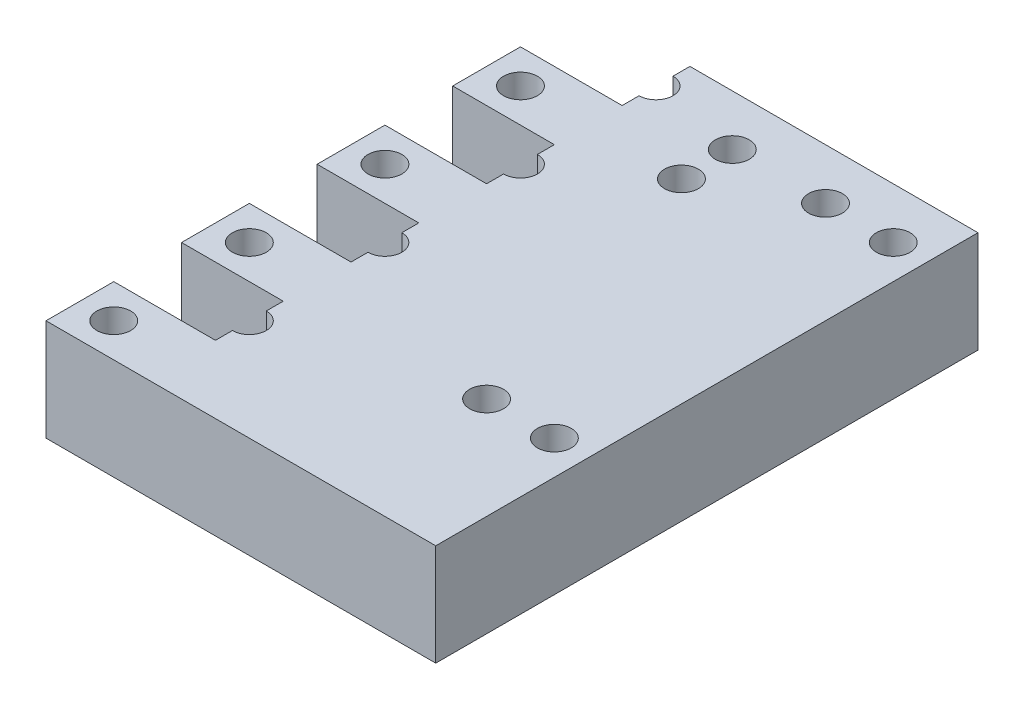
ISO-10303-21;
HEADER;
FILE_DESCRIPTION(('STEP AP214'),'2;1');
FILE_NAME('part.step','',(''),(''),'','','');
FILE_SCHEMA(('AUTOMOTIVE_DESIGN { 1 0 10303 214 1 1 1 1 }'));
ENDSEC;
DATA;
#1=APPLICATION_CONTEXT('core data for automotive mechanical design processes');
#2=APPLICATION_PROTOCOL_DEFINITION('international standard','automotive_design',2000,#1);
#3=PRODUCT_CONTEXT('',#1,'mechanical');
#4=PRODUCT('Part','Part','',(#3));
#5=PRODUCT_RELATED_PRODUCT_CATEGORY('part','',(#4));
#6=PRODUCT_DEFINITION_FORMATION('','',#4);
#7=PRODUCT_DEFINITION_CONTEXT('part definition',#1,'design');
#8=PRODUCT_DEFINITION('design','',#6,#7);
#9=PRODUCT_DEFINITION_SHAPE('','',#8);
#10=(LENGTH_UNIT() NAMED_UNIT(*) SI_UNIT(.MILLI.,.METRE.));
#11=(NAMED_UNIT(*) PLANE_ANGLE_UNIT() SI_UNIT($,.RADIAN.));
#12=(NAMED_UNIT(*) SI_UNIT($,.STERADIAN.) SOLID_ANGLE_UNIT());
#13=UNCERTAINTY_MEASURE_WITH_UNIT(LENGTH_MEASURE(1.E-05),#10,'distance_accuracy_value','');
#14=(GEOMETRIC_REPRESENTATION_CONTEXT(3) GLOBAL_UNCERTAINTY_ASSIGNED_CONTEXT((#13)) GLOBAL_UNIT_ASSIGNED_CONTEXT((#10,
#11,#12)) REPRESENTATION_CONTEXT('',''));
#15=CARTESIAN_POINT('',(0.,0.,0.));
#16=DIRECTION('',(0.,0.,1.));
#17=DIRECTION('',(1.,0.,0.));
#18=AXIS2_PLACEMENT_3D('',#15,#16,#17);
#19=CARTESIAN_POINT('',(6.,6.,-4.));
#20=DIRECTION('',(1.,0.,0.));
#21=DIRECTION('',(0.,0.,-1.));
#22=AXIS2_PLACEMENT_3D('',#19,#20,#21);
#23=PLANE('',#22);
#24=DIRECTION('',(0.,0.,1.));
#25=VECTOR('',#24,1.);
#26=CARTESIAN_POINT('',(6.,0.,-4.));
#27=LINE('',#26,#25);
#28=CARTESIAN_POINT('',(6.,0.,-8.));
#29=VERTEX_POINT('',#28);
#30=CARTESIAN_POINT('',(6.,0.,-7.));
#31=VERTEX_POINT('',#30);
#32=EDGE_CURVE('E228',#29,#31,#27,.T.);
#33=ORIENTED_EDGE('',*,*,#32,.T.);
#34=DIRECTION('',(0.,1.,0.));
#35=VECTOR('',#34,1.);
#36=CARTESIAN_POINT('',(6.,0.,-7.));
#37=LINE('',#36,#35);
#38=CARTESIAN_POINT('',(6.,6.,-7.));
#39=VERTEX_POINT('',#38);
#40=EDGE_CURVE('E49',#31,#39,#37,.T.);
#41=ORIENTED_EDGE('',*,*,#40,.T.);
#42=DIRECTION('',(0.,0.,1.));
#43=VECTOR('',#42,1.);
#44=CARTESIAN_POINT('',(6.,6.,-4.));
#45=LINE('',#44,#43);
#46=CARTESIAN_POINT('',(6.,6.,-8.));
#47=VERTEX_POINT('',#46);
#48=EDGE_CURVE('E346',#47,#39,#45,.T.);
#49=ORIENTED_EDGE('',*,*,#48,.F.);
#50=DIRECTION('',(0.,-1.,0.));
#51=VECTOR('',#50,1.);
#52=CARTESIAN_POINT('',(6.,6.,-8.));
#53=LINE('',#52,#51);
#54=EDGE_CURVE('E248',#47,#29,#53,.T.);
#55=ORIENTED_EDGE('',*,*,#54,.T.);
#56=EDGE_LOOP('',(#33,#41,#49,#55));
#57=FACE_BOUND('',#56,.T.);
#58=ADVANCED_FACE('F34',(#57),#23,.F.);
#59=CARTESIAN_POINT('',(6.,6.,-12.));
#60=DIRECTION('',(1.,0.,0.));
#61=DIRECTION('',(0.,0.,-1.));
#62=AXIS2_PLACEMENT_3D('',#59,#60,#61);
#63=PLANE('',#62);
#64=DIRECTION('',(0.,0.,1.));
#65=VECTOR('',#64,1.);
#66=CARTESIAN_POINT('',(6.,0.,-12.));
#67=LINE('',#66,#65);
#68=CARTESIAN_POINT('',(6.,0.,-16.));
#69=VERTEX_POINT('',#68);
#70=CARTESIAN_POINT('',(6.,0.,-15.));
#71=VERTEX_POINT('',#70);
#72=EDGE_CURVE('E326',#69,#71,#67,.T.);
#73=ORIENTED_EDGE('',*,*,#72,.T.);
#74=DIRECTION('',(0.,1.,0.));
#75=VECTOR('',#74,1.);
#76=CARTESIAN_POINT('',(6.,0.,-15.));
#77=LINE('',#76,#75);
#78=CARTESIAN_POINT('',(6.,6.,-15.));
#79=VERTEX_POINT('',#78);
#80=EDGE_CURVE('E57',#71,#79,#77,.T.);
#81=ORIENTED_EDGE('',*,*,#80,.T.);
#82=DIRECTION('',(0.,0.,1.));
#83=VECTOR('',#82,1.);
#84=CARTESIAN_POINT('',(6.,6.,-12.));
#85=LINE('',#84,#83);
#86=CARTESIAN_POINT('',(6.,6.,-16.));
#87=VERTEX_POINT('',#86);
#88=EDGE_CURVE('E396',#87,#79,#85,.T.);
#89=ORIENTED_EDGE('',*,*,#88,.F.);
#90=DIRECTION('',(0.,-1.,0.));
#91=VECTOR('',#90,1.);
#92=CARTESIAN_POINT('',(6.,6.,-16.));
#93=LINE('',#92,#91);
#94=EDGE_CURVE('E260',#87,#69,#93,.T.);
#95=ORIENTED_EDGE('',*,*,#94,.T.);
#96=EDGE_LOOP('',(#73,#81,#89,#95));
#97=FACE_BOUND('',#96,.T.);
#98=ADVANCED_FACE('F421',(#97),#63,.F.);
#99=CARTESIAN_POINT('',(6.,6.,-28.));
#100=DIRECTION('',(1.,0.,0.));
#101=DIRECTION('',(0.,0.,-1.));
#102=AXIS2_PLACEMENT_3D('',#99,#100,#101);
#103=PLANE('',#102);
#104=DIRECTION('',(0.,0.,1.));
#105=VECTOR('',#104,1.);
#106=CARTESIAN_POINT('',(6.,0.,-28.));
#107=LINE('',#106,#105);
#108=CARTESIAN_POINT('',(6.,0.,-32.));
#109=VERTEX_POINT('',#108);
#110=CARTESIAN_POINT('',(6.,0.,-31.));
#111=VERTEX_POINT('',#110);
#112=EDGE_CURVE('E301',#109,#111,#107,.T.);
#113=ORIENTED_EDGE('',*,*,#112,.T.);
#114=DIRECTION('',(0.,1.,0.));
#115=VECTOR('',#114,1.);
#116=CARTESIAN_POINT('',(6.,0.,-31.));
#117=LINE('',#116,#115);
#118=CARTESIAN_POINT('',(6.,6.,-31.));
#119=VERTEX_POINT('',#118);
#120=EDGE_CURVE('E516',#111,#119,#117,.T.);
#121=ORIENTED_EDGE('',*,*,#120,.T.);
#122=DIRECTION('',(0.,0.,1.));
#123=VECTOR('',#122,1.);
#124=CARTESIAN_POINT('',(6.,6.,-28.));
#125=LINE('',#124,#123);
#126=CARTESIAN_POINT('',(6.,6.,-32.));
#127=VERTEX_POINT('',#126);
#128=EDGE_CURVE('E376',#127,#119,#125,.T.);
#129=ORIENTED_EDGE('',*,*,#128,.F.);
#130=DIRECTION('',(0.,-1.,0.));
#131=VECTOR('',#130,1.);
#132=CARTESIAN_POINT('',(6.,6.,-32.));
#133=LINE('',#132,#131);
#134=EDGE_CURVE('E284',#127,#109,#133,.T.);
#135=ORIENTED_EDGE('',*,*,#134,.T.);
#136=EDGE_LOOP('',(#113,#121,#129,#135));
#137=FACE_BOUND('',#136,.T.);
#138=ADVANCED_FACE('F426',(#137),#103,.F.);
#139=CARTESIAN_POINT('',(6.,6.,-20.));
#140=DIRECTION('',(1.,0.,0.));
#141=DIRECTION('',(0.,0.,-1.));
#142=AXIS2_PLACEMENT_3D('',#139,#140,#141);
#143=PLANE('',#142);
#144=DIRECTION('',(0.,0.,1.));
#145=VECTOR('',#144,1.);
#146=CARTESIAN_POINT('',(6.,0.,-20.));
#147=LINE('',#146,#145);
#148=CARTESIAN_POINT('',(6.,0.,-24.));
#149=VERTEX_POINT('',#148);
#150=CARTESIAN_POINT('',(6.,0.,-23.));
#151=VERTEX_POINT('',#150);
#152=EDGE_CURVE('E316',#149,#151,#147,.T.);
#153=ORIENTED_EDGE('',*,*,#152,.T.);
#154=DIRECTION('',(0.,1.,0.));
#155=VECTOR('',#154,1.);
#156=CARTESIAN_POINT('',(6.,0.,-23.));
#157=LINE('',#156,#155);
#158=CARTESIAN_POINT('',(6.,6.,-23.));
#159=VERTEX_POINT('',#158);
#160=EDGE_CURVE('E527',#151,#159,#157,.T.);
#161=ORIENTED_EDGE('',*,*,#160,.T.);
#162=DIRECTION('',(0.,0.,1.));
#163=VECTOR('',#162,1.);
#164=CARTESIAN_POINT('',(6.,6.,-20.));
#165=LINE('',#164,#163);
#166=CARTESIAN_POINT('',(6.,6.,-24.));
#167=VERTEX_POINT('',#166);
#168=EDGE_CURVE('E386',#167,#159,#165,.T.);
#169=ORIENTED_EDGE('',*,*,#168,.F.);
#170=DIRECTION('',(0.,-1.,0.));
#171=VECTOR('',#170,1.);
#172=CARTESIAN_POINT('',(6.,6.,-24.));
#173=LINE('',#172,#171);
#174=EDGE_CURVE('E272',#167,#149,#173,.T.);
#175=ORIENTED_EDGE('',*,*,#174,.T.);
#176=EDGE_LOOP('',(#153,#161,#169,#175));
#177=FACE_BOUND('',#176,.T.);
#178=ADVANCED_FACE('F466',(#177),#143,.F.);
#179=CARTESIAN_POINT('',(23.,6.,0.));
#180=DIRECTION('',(0.,0.,-1.));
#181=DIRECTION('',(-1.,0.,0.));
#182=AXIS2_PLACEMENT_3D('',#179,#180,#181);
#183=PLANE('',#182);
#184=DIRECTION('',(1.,0.,0.));
#185=VECTOR('',#184,1.);
#186=CARTESIAN_POINT('',(23.,0.,0.));
#187=LINE('',#186,#185);
#188=CARTESIAN_POINT('',(0.,0.,0.));
#189=VERTEX_POINT('',#188);
#190=CARTESIAN_POINT('',(23.,0.,0.));
#191=VERTEX_POINT('',#190);
#192=EDGE_CURVE('E305',#189,#191,#187,.T.);
#193=ORIENTED_EDGE('',*,*,#192,.T.);
#194=DIRECTION('',(0.,-1.,0.));
#195=VECTOR('',#194,1.);
#196=CARTESIAN_POINT('',(23.,6.,0.));
#197=LINE('',#196,#195);
#198=CARTESIAN_POINT('',(23.,6.,0.));
#199=VERTEX_POINT('',#198);
#200=EDGE_CURVE('E11',#199,#191,#197,.T.);
#201=ORIENTED_EDGE('',*,*,#200,.F.);
#202=DIRECTION('',(1.,0.,0.));
#203=VECTOR('',#202,1.);
#204=CARTESIAN_POINT('',(23.,6.,0.));
#205=LINE('',#204,#203);
#206=CARTESIAN_POINT('',(0.,6.,0.));
#207=VERTEX_POINT('',#206);
#208=EDGE_CURVE('E238',#207,#199,#205,.T.);
#209=ORIENTED_EDGE('',*,*,#208,.F.);
#210=DIRECTION('',(0.,-1.,0.));
#211=VECTOR('',#210,1.);
#212=CARTESIAN_POINT('',(0.,6.,0.));
#213=LINE('',#212,#211);
#214=EDGE_CURVE('E239',#207,#189,#213,.T.);
#215=ORIENTED_EDGE('',*,*,#214,.T.);
#216=EDGE_LOOP('',(#193,#201,#209,#215));
#217=FACE_BOUND('',#216,.T.);
#218=ADVANCED_FACE('F36',(#217),#183,.F.);
#219=CARTESIAN_POINT('',(23.,6.,-32.));
#220=DIRECTION('',(-1.,0.,0.));
#221=DIRECTION('',(0.,0.,1.));
#222=AXIS2_PLACEMENT_3D('',#219,#220,#221);
#223=PLANE('',#222);
#224=DIRECTION('',(0.,0.,-1.));
#225=VECTOR('',#224,1.);
#226=CARTESIAN_POINT('',(23.,0.,-32.));
#227=LINE('',#226,#225);
#228=CARTESIAN_POINT('',(23.,0.,-32.));
#229=VERTEX_POINT('',#228);
#230=EDGE_CURVE('E298',#191,#229,#227,.T.);
#231=ORIENTED_EDGE('',*,*,#230,.T.);
#232=DIRECTION('',(0.,-1.,0.));
#233=VECTOR('',#232,1.);
#234=CARTESIAN_POINT('',(23.,6.,-32.));
#235=LINE('',#234,#233);
#236=CARTESIAN_POINT('',(23.,6.,-32.));
#237=VERTEX_POINT('',#236);
#238=EDGE_CURVE('E42',#237,#229,#235,.T.);
#239=ORIENTED_EDGE('',*,*,#238,.F.);
#240=DIRECTION('',(0.,0.,-1.));
#241=VECTOR('',#240,1.);
#242=CARTESIAN_POINT('',(23.,6.,-32.));
#243=LINE('',#242,#241);
#244=EDGE_CURVE('E372',#199,#237,#243,.T.);
#245=ORIENTED_EDGE('',*,*,#244,.F.);
#246=ORIENTED_EDGE('',*,*,#200,.T.);
#247=EDGE_LOOP('',(#231,#239,#245,#246));
#248=FACE_BOUND('',#247,.T.);
#249=ADVANCED_FACE('F483',(#248),#223,.F.);
#250=CARTESIAN_POINT('',(6.,6.,-32.));
#251=DIRECTION('',(0.,0.,1.));
#252=DIRECTION('',(1.,0.,0.));
#253=AXIS2_PLACEMENT_3D('',#250,#251,#252);
#254=PLANE('',#253);
#255=DIRECTION('',(-1.,0.,0.));
#256=VECTOR('',#255,1.);
#257=CARTESIAN_POINT('',(6.,0.,-32.));
#258=LINE('',#257,#256);
#259=EDGE_CURVE('E293',#229,#109,#258,.T.);
#260=ORIENTED_EDGE('',*,*,#259,.T.);
#261=ORIENTED_EDGE('',*,*,#134,.F.);
#262=DIRECTION('',(-1.,0.,0.));
#263=VECTOR('',#262,1.);
#264=CARTESIAN_POINT('',(6.,6.,-32.));
#265=LINE('',#264,#263);
#266=EDGE_CURVE('E294',#237,#127,#265,.T.);
#267=ORIENTED_EDGE('',*,*,#266,.F.);
#268=ORIENTED_EDGE('',*,*,#238,.T.);
#269=EDGE_LOOP('',(#260,#261,#267,#268));
#270=FACE_BOUND('',#269,.T.);
#271=ADVANCED_FACE('F291',(#270),#254,.F.);
#272=CARTESIAN_POINT('',(6.,6.,-29.));
#273=VERTEX_POINT('',#272);
#274=CARTESIAN_POINT('',(6.,6.,-28.));
#275=VERTEX_POINT('',#274);
#276=EDGE_CURVE('E375',#273,#275,#125,.T.);
#277=ORIENTED_EDGE('',*,*,#276,.F.);
#278=DIRECTION('',(0.,1.,0.));
#279=VECTOR('',#278,1.);
#280=CARTESIAN_POINT('',(6.,0.,-29.));
#281=LINE('',#280,#279);
#282=CARTESIAN_POINT('',(6.,0.,-29.));
#283=VERTEX_POINT('',#282);
#284=EDGE_CURVE('E512',#273,#283,#281,.F.);
#285=ORIENTED_EDGE('',*,*,#284,.T.);
#286=CARTESIAN_POINT('',(6.,0.,-28.));
#287=VERTEX_POINT('',#286);
#288=EDGE_CURVE('E302',#283,#287,#107,.T.);
#289=ORIENTED_EDGE('',*,*,#288,.T.);
#290=DIRECTION('',(0.,-1.,0.));
#291=VECTOR('',#290,1.);
#292=CARTESIAN_POINT('',(6.,6.,-28.));
#293=LINE('',#292,#291);
#294=EDGE_CURVE('E281',#275,#287,#293,.T.);
#295=ORIENTED_EDGE('',*,*,#294,.F.);
#296=EDGE_LOOP('',(#277,#285,#289,#295));
#297=FACE_BOUND('',#296,.T.);
#298=ADVANCED_FACE('F477',(#297),#103,.F.);
#299=CARTESIAN_POINT('',(0.,6.,-28.));
#300=DIRECTION('',(0.,0.,1.));
#301=DIRECTION('',(1.,0.,0.));
#302=AXIS2_PLACEMENT_3D('',#299,#300,#301);
#303=PLANE('',#302);
#304=DIRECTION('',(-1.,0.,0.));
#305=VECTOR('',#304,1.);
#306=CARTESIAN_POINT('',(0.,0.,-28.));
#307=LINE('',#306,#305);
#308=CARTESIAN_POINT('',(0.,0.,-28.));
#309=VERTEX_POINT('',#308);
#310=EDGE_CURVE('E309',#287,#309,#307,.T.);
#311=ORIENTED_EDGE('',*,*,#310,.T.);
#312=DIRECTION('',(0.,-1.,0.));
#313=VECTOR('',#312,1.);
#314=CARTESIAN_POINT('',(0.,6.,-28.));
#315=LINE('',#314,#313);
#316=CARTESIAN_POINT('',(0.,6.,-28.));
#317=VERTEX_POINT('',#316);
#318=EDGE_CURVE('E278',#317,#309,#315,.T.);
#319=ORIENTED_EDGE('',*,*,#318,.F.);
#320=DIRECTION('',(-1.,0.,0.));
#321=VECTOR('',#320,1.);
#322=CARTESIAN_POINT('',(0.,6.,-28.));
#323=LINE('',#322,#321);
#324=EDGE_CURVE('E379',#275,#317,#323,.T.);
#325=ORIENTED_EDGE('',*,*,#324,.F.);
#326=ORIENTED_EDGE('',*,*,#294,.T.);
#327=EDGE_LOOP('',(#311,#319,#325,#326));
#328=FACE_BOUND('',#327,.T.);
#329=ADVANCED_FACE('F473',(#328),#303,.F.);
#330=CARTESIAN_POINT('',(0.,6.,-24.));
#331=DIRECTION('',(1.,0.,0.));
#332=DIRECTION('',(0.,0.,-1.));
#333=AXIS2_PLACEMENT_3D('',#330,#331,#332);
#334=PLANE('',#333);
#335=DIRECTION('',(0.,0.,1.));
#336=VECTOR('',#335,1.);
#337=CARTESIAN_POINT('',(0.,0.,-24.));
#338=LINE('',#337,#336);
#339=CARTESIAN_POINT('',(0.,0.,-24.));
#340=VERTEX_POINT('',#339);
#341=EDGE_CURVE('E311',#309,#340,#338,.T.);
#342=ORIENTED_EDGE('',*,*,#341,.T.);
#343=DIRECTION('',(0.,-1.,0.));
#344=VECTOR('',#343,1.);
#345=CARTESIAN_POINT('',(0.,6.,-24.));
#346=LINE('',#345,#344);
#347=CARTESIAN_POINT('',(0.,6.,-24.));
#348=VERTEX_POINT('',#347);
#349=EDGE_CURVE('E275',#348,#340,#346,.T.);
#350=ORIENTED_EDGE('',*,*,#349,.F.);
#351=DIRECTION('',(0.,0.,1.));
#352=VECTOR('',#351,1.);
#353=CARTESIAN_POINT('',(0.,6.,-24.));
#354=LINE('',#353,#352);
#355=EDGE_CURVE('E381',#317,#348,#354,.T.);
#356=ORIENTED_EDGE('',*,*,#355,.F.);
#357=ORIENTED_EDGE('',*,*,#318,.T.);
#358=EDGE_LOOP('',(#342,#350,#356,#357));
#359=FACE_BOUND('',#358,.T.);
#360=ADVANCED_FACE('F469',(#359),#334,.F.);
#361=CARTESIAN_POINT('',(6.,6.,-24.));
#362=DIRECTION('',(0.,0.,-1.));
#363=DIRECTION('',(-1.,0.,0.));
#364=AXIS2_PLACEMENT_3D('',#361,#362,#363);
#365=PLANE('',#364);
#366=DIRECTION('',(1.,0.,0.));
#367=VECTOR('',#366,1.);
#368=CARTESIAN_POINT('',(6.,0.,-24.));
#369=LINE('',#368,#367);
#370=EDGE_CURVE('E313',#340,#149,#369,.T.);
#371=ORIENTED_EDGE('',*,*,#370,.T.);
#372=ORIENTED_EDGE('',*,*,#174,.F.);
#373=DIRECTION('',(1.,0.,0.));
#374=VECTOR('',#373,1.);
#375=CARTESIAN_POINT('',(6.,6.,-24.));
#376=LINE('',#375,#374);
#377=EDGE_CURVE('E383',#348,#167,#376,.T.);
#378=ORIENTED_EDGE('',*,*,#377,.F.);
#379=ORIENTED_EDGE('',*,*,#349,.T.);
#380=EDGE_LOOP('',(#371,#372,#378,#379));
#381=FACE_BOUND('',#380,.T.);
#382=ADVANCED_FACE('F464',(#381),#365,.F.);
#383=CARTESIAN_POINT('',(6.,6.,-21.));
#384=VERTEX_POINT('',#383);
#385=CARTESIAN_POINT('',(6.,6.,-20.));
#386=VERTEX_POINT('',#385);
#387=EDGE_CURVE('E385',#384,#386,#165,.T.);
#388=ORIENTED_EDGE('',*,*,#387,.F.);
#389=DIRECTION('',(0.,1.,0.));
#390=VECTOR('',#389,1.);
#391=CARTESIAN_POINT('',(6.,0.,-21.));
#392=LINE('',#391,#390);
#393=CARTESIAN_POINT('',(6.,0.,-21.));
#394=VERTEX_POINT('',#393);
#395=EDGE_CURVE('E523',#384,#394,#392,.F.);
#396=ORIENTED_EDGE('',*,*,#395,.T.);
#397=CARTESIAN_POINT('',(6.,0.,-20.));
#398=VERTEX_POINT('',#397);
#399=EDGE_CURVE('E315',#394,#398,#147,.T.);
#400=ORIENTED_EDGE('',*,*,#399,.T.);
#401=DIRECTION('',(0.,-1.,0.));
#402=VECTOR('',#401,1.);
#403=CARTESIAN_POINT('',(6.,6.,-20.));
#404=LINE('',#403,#402);
#405=EDGE_CURVE('E269',#386,#398,#404,.T.);
#406=ORIENTED_EDGE('',*,*,#405,.F.);
#407=EDGE_LOOP('',(#388,#396,#400,#406));
#408=FACE_BOUND('',#407,.T.);
#409=ADVANCED_FACE('F460',(#408),#143,.F.);
#410=CARTESIAN_POINT('',(0.,6.,-20.));
#411=DIRECTION('',(0.,0.,1.));
#412=DIRECTION('',(1.,0.,0.));
#413=AXIS2_PLACEMENT_3D('',#410,#411,#412);
#414=PLANE('',#413);
#415=DIRECTION('',(-1.,0.,0.));
#416=VECTOR('',#415,1.);
#417=CARTESIAN_POINT('',(0.,0.,-20.));
#418=LINE('',#417,#416);
#419=CARTESIAN_POINT('',(0.,0.,-20.));
#420=VERTEX_POINT('',#419);
#421=EDGE_CURVE('E319',#398,#420,#418,.T.);
#422=ORIENTED_EDGE('',*,*,#421,.T.);
#423=DIRECTION('',(0.,-1.,0.));
#424=VECTOR('',#423,1.);
#425=CARTESIAN_POINT('',(0.,6.,-20.));
#426=LINE('',#425,#424);
#427=CARTESIAN_POINT('',(0.,6.,-20.));
#428=VERTEX_POINT('',#427);
#429=EDGE_CURVE('E266',#428,#420,#426,.T.);
#430=ORIENTED_EDGE('',*,*,#429,.F.);
#431=DIRECTION('',(-1.,0.,0.));
#432=VECTOR('',#431,1.);
#433=CARTESIAN_POINT('',(0.,6.,-20.));
#434=LINE('',#433,#432);
#435=EDGE_CURVE('E389',#386,#428,#434,.T.);
#436=ORIENTED_EDGE('',*,*,#435,.F.);
#437=ORIENTED_EDGE('',*,*,#405,.T.);
#438=EDGE_LOOP('',(#422,#430,#436,#437));
#439=FACE_BOUND('',#438,.T.);
#440=ADVANCED_FACE('F456',(#439),#414,.F.);
#441=CARTESIAN_POINT('',(0.,6.,-16.));
#442=DIRECTION('',(1.,0.,0.));
#443=DIRECTION('',(0.,0.,-1.));
#444=AXIS2_PLACEMENT_3D('',#441,#442,#443);
#445=PLANE('',#444);
#446=DIRECTION('',(0.,0.,1.));
#447=VECTOR('',#446,1.);
#448=CARTESIAN_POINT('',(0.,0.,-16.));
#449=LINE('',#448,#447);
#450=CARTESIAN_POINT('',(0.,0.,-16.));
#451=VERTEX_POINT('',#450);
#452=EDGE_CURVE('E321',#420,#451,#449,.T.);
#453=ORIENTED_EDGE('',*,*,#452,.T.);
#454=DIRECTION('',(0.,-1.,0.));
#455=VECTOR('',#454,1.);
#456=CARTESIAN_POINT('',(0.,6.,-16.));
#457=LINE('',#456,#455);
#458=CARTESIAN_POINT('',(0.,6.,-16.));
#459=VERTEX_POINT('',#458);
#460=EDGE_CURVE('E263',#459,#451,#457,.T.);
#461=ORIENTED_EDGE('',*,*,#460,.F.);
#462=DIRECTION('',(0.,0.,1.));
#463=VECTOR('',#462,1.);
#464=CARTESIAN_POINT('',(0.,6.,-16.));
#465=LINE('',#464,#463);
#466=EDGE_CURVE('E391',#428,#459,#465,.T.);
#467=ORIENTED_EDGE('',*,*,#466,.F.);
#468=ORIENTED_EDGE('',*,*,#429,.T.);
#469=EDGE_LOOP('',(#453,#461,#467,#468));
#470=FACE_BOUND('',#469,.T.);
#471=ADVANCED_FACE('F452',(#470),#445,.F.);
#472=CARTESIAN_POINT('',(6.,6.,-16.));
#473=DIRECTION('',(0.,0.,-1.));
#474=DIRECTION('',(-1.,0.,0.));
#475=AXIS2_PLACEMENT_3D('',#472,#473,#474);
#476=PLANE('',#475);
#477=DIRECTION('',(1.,0.,0.));
#478=VECTOR('',#477,1.);
#479=CARTESIAN_POINT('',(6.,0.,-16.));
#480=LINE('',#479,#478);
#481=EDGE_CURVE('E323',#451,#69,#480,.T.);
#482=ORIENTED_EDGE('',*,*,#481,.T.);
#483=ORIENTED_EDGE('',*,*,#94,.F.);
#484=DIRECTION('',(1.,0.,0.));
#485=VECTOR('',#484,1.);
#486=CARTESIAN_POINT('',(6.,6.,-16.));
#487=LINE('',#486,#485);
#488=EDGE_CURVE('E393',#459,#87,#487,.T.);
#489=ORIENTED_EDGE('',*,*,#488,.F.);
#490=ORIENTED_EDGE('',*,*,#460,.T.);
#491=EDGE_LOOP('',(#482,#483,#489,#490));
#492=FACE_BOUND('',#491,.T.);
#493=ADVANCED_FACE('F448',(#492),#476,.F.);
#494=CARTESIAN_POINT('',(6.,6.,-13.));
#495=VERTEX_POINT('',#494);
#496=CARTESIAN_POINT('',(6.,6.,-12.));
#497=VERTEX_POINT('',#496);
#498=EDGE_CURVE('E395',#495,#497,#85,.T.);
#499=ORIENTED_EDGE('',*,*,#498,.F.);
#500=DIRECTION('',(0.,1.,0.));
#501=VECTOR('',#500,1.);
#502=CARTESIAN_POINT('',(6.,0.,-13.));
#503=LINE('',#502,#501);
#504=CARTESIAN_POINT('',(6.,0.,-13.));
#505=VERTEX_POINT('',#504);
#506=EDGE_CURVE('E504',#495,#505,#503,.F.);
#507=ORIENTED_EDGE('',*,*,#506,.T.);
#508=CARTESIAN_POINT('',(6.,0.,-12.));
#509=VERTEX_POINT('',#508);
#510=EDGE_CURVE('E325',#505,#509,#67,.T.);
#511=ORIENTED_EDGE('',*,*,#510,.T.);
#512=DIRECTION('',(0.,-1.,0.));
#513=VECTOR('',#512,1.);
#514=CARTESIAN_POINT('',(6.,6.,-12.));
#515=LINE('',#514,#513);
#516=EDGE_CURVE('E257',#497,#509,#515,.T.);
#517=ORIENTED_EDGE('',*,*,#516,.F.);
#518=EDGE_LOOP('',(#499,#507,#511,#517));
#519=FACE_BOUND('',#518,.T.);
#520=ADVANCED_FACE('F429',(#519),#63,.F.);
#521=CARTESIAN_POINT('',(0.,6.,-12.));
#522=DIRECTION('',(0.,0.,1.));
#523=DIRECTION('',(1.,0.,0.));
#524=AXIS2_PLACEMENT_3D('',#521,#522,#523);
#525=PLANE('',#524);
#526=DIRECTION('',(-1.,0.,0.));
#527=VECTOR('',#526,1.);
#528=CARTESIAN_POINT('',(0.,0.,-12.));
#529=LINE('',#528,#527);
#530=CARTESIAN_POINT('',(0.,0.,-12.));
#531=VERTEX_POINT('',#530);
#532=EDGE_CURVE('E329',#509,#531,#529,.T.);
#533=ORIENTED_EDGE('',*,*,#532,.T.);
#534=DIRECTION('',(0.,-1.,0.));
#535=VECTOR('',#534,1.);
#536=CARTESIAN_POINT('',(0.,6.,-12.));
#537=LINE('',#536,#535);
#538=CARTESIAN_POINT('',(0.,6.,-12.));
#539=VERTEX_POINT('',#538);
#540=EDGE_CURVE('E254',#539,#531,#537,.T.);
#541=ORIENTED_EDGE('',*,*,#540,.F.);
#542=DIRECTION('',(-1.,0.,0.));
#543=VECTOR('',#542,1.);
#544=CARTESIAN_POINT('',(0.,6.,-12.));
#545=LINE('',#544,#543);
#546=EDGE_CURVE('E399',#497,#539,#545,.T.);
#547=ORIENTED_EDGE('',*,*,#546,.F.);
#548=ORIENTED_EDGE('',*,*,#516,.T.);
#549=EDGE_LOOP('',(#533,#541,#547,#548));
#550=FACE_BOUND('',#549,.T.);
#551=ADVANCED_FACE('F441',(#550),#525,.F.);
#552=CARTESIAN_POINT('',(0.,6.,-8.));
#553=DIRECTION('',(1.,0.,0.));
#554=DIRECTION('',(0.,0.,-1.));
#555=AXIS2_PLACEMENT_3D('',#552,#553,#554);
#556=PLANE('',#555);
#557=DIRECTION('',(0.,0.,1.));
#558=VECTOR('',#557,1.);
#559=CARTESIAN_POINT('',(0.,0.,-8.));
#560=LINE('',#559,#558);
#561=CARTESIAN_POINT('',(0.,0.,-8.));
#562=VERTEX_POINT('',#561);
#563=EDGE_CURVE('E231',#531,#562,#560,.T.);
#564=ORIENTED_EDGE('',*,*,#563,.T.);
#565=DIRECTION('',(0.,-1.,0.));
#566=VECTOR('',#565,1.);
#567=CARTESIAN_POINT('',(0.,6.,-8.));
#568=LINE('',#567,#566);
#569=CARTESIAN_POINT('',(0.,6.,-8.));
#570=VERTEX_POINT('',#569);
#571=EDGE_CURVE('E251',#570,#562,#568,.T.);
#572=ORIENTED_EDGE('',*,*,#571,.F.);
#573=DIRECTION('',(0.,0.,1.));
#574=VECTOR('',#573,1.);
#575=CARTESIAN_POINT('',(0.,6.,-8.));
#576=LINE('',#575,#574);
#577=EDGE_CURVE('E400',#539,#570,#576,.T.);
#578=ORIENTED_EDGE('',*,*,#577,.F.);
#579=ORIENTED_EDGE('',*,*,#540,.T.);
#580=EDGE_LOOP('',(#564,#572,#578,#579));
#581=FACE_BOUND('',#580,.T.);
#582=ADVANCED_FACE('F333',(#581),#556,.F.);
#583=CARTESIAN_POINT('',(6.,6.,-8.));
#584=DIRECTION('',(0.,0.,-1.));
#585=DIRECTION('',(-1.,0.,0.));
#586=AXIS2_PLACEMENT_3D('',#583,#584,#585);
#587=PLANE('',#586);
#588=DIRECTION('',(1.,0.,0.));
#589=VECTOR('',#588,1.);
#590=CARTESIAN_POINT('',(6.,0.,-8.));
#591=LINE('',#590,#589);
#592=EDGE_CURVE('E229',#562,#29,#591,.T.);
#593=ORIENTED_EDGE('',*,*,#592,.T.);
#594=ORIENTED_EDGE('',*,*,#54,.F.);
#595=DIRECTION('',(1.,0.,0.));
#596=VECTOR('',#595,1.);
#597=CARTESIAN_POINT('',(6.,6.,-8.));
#598=LINE('',#597,#596);
#599=EDGE_CURVE('E342',#570,#47,#598,.T.);
#600=ORIENTED_EDGE('',*,*,#599,.F.);
#601=ORIENTED_EDGE('',*,*,#571,.T.);
#602=EDGE_LOOP('',(#593,#594,#600,#601));
#603=FACE_BOUND('',#602,.T.);
#604=ADVANCED_FACE('F340',(#603),#587,.F.);
#605=CARTESIAN_POINT('',(6.,6.,-5.));
#606=VERTEX_POINT('',#605);
#607=CARTESIAN_POINT('',(6.,6.,-4.));
#608=VERTEX_POINT('',#607);
#609=EDGE_CURVE('E221',#606,#608,#45,.T.);
#610=ORIENTED_EDGE('',*,*,#609,.F.);
#611=DIRECTION('',(0.,1.,0.));
#612=VECTOR('',#611,1.);
#613=CARTESIAN_POINT('',(6.,0.,-5.));
#614=LINE('',#613,#612);
#615=CARTESIAN_POINT('',(6.,0.,-5.));
#616=VERTEX_POINT('',#615);
#617=EDGE_CURVE('E207',#606,#616,#614,.F.);
#618=ORIENTED_EDGE('',*,*,#617,.T.);
#619=CARTESIAN_POINT('',(6.,0.,-4.));
#620=VERTEX_POINT('',#619);
#621=EDGE_CURVE('E219',#616,#620,#27,.T.);
#622=ORIENTED_EDGE('',*,*,#621,.T.);
#623=DIRECTION('',(0.,-1.,0.));
#624=VECTOR('',#623,1.);
#625=CARTESIAN_POINT('',(6.,6.,-4.));
#626=LINE('',#625,#624);
#627=EDGE_CURVE('E246',#608,#620,#626,.T.);
#628=ORIENTED_EDGE('',*,*,#627,.F.);
#629=EDGE_LOOP('',(#610,#618,#622,#628));
#630=FACE_BOUND('',#629,.T.);
#631=ADVANCED_FACE('F217',(#630),#23,.F.);
#632=CARTESIAN_POINT('',(0.,6.,-4.));
#633=DIRECTION('',(0.,0.,1.));
#634=DIRECTION('',(1.,0.,0.));
#635=AXIS2_PLACEMENT_3D('',#632,#633,#634);
#636=PLANE('',#635);
#637=DIRECTION('',(-1.,0.,0.));
#638=VECTOR('',#637,1.);
#639=CARTESIAN_POINT('',(0.,0.,-4.));
#640=LINE('',#639,#638);
#641=CARTESIAN_POINT('',(0.,0.,-4.));
#642=VERTEX_POINT('',#641);
#643=EDGE_CURVE('E227',#620,#642,#640,.T.);
#644=ORIENTED_EDGE('',*,*,#643,.T.);
#645=DIRECTION('',(0.,-1.,0.));
#646=VECTOR('',#645,1.);
#647=CARTESIAN_POINT('',(0.,6.,-4.));
#648=LINE('',#647,#646);
#649=CARTESIAN_POINT('',(0.,6.,-4.));
#650=VERTEX_POINT('',#649);
#651=EDGE_CURVE('E242',#650,#642,#648,.T.);
#652=ORIENTED_EDGE('',*,*,#651,.F.);
#653=DIRECTION('',(-1.,0.,0.));
#654=VECTOR('',#653,1.);
#655=CARTESIAN_POINT('',(0.,6.,-4.));
#656=LINE('',#655,#654);
#657=EDGE_CURVE('E348',#608,#650,#656,.T.);
#658=ORIENTED_EDGE('',*,*,#657,.F.);
#659=ORIENTED_EDGE('',*,*,#627,.T.);
#660=EDGE_LOOP('',(#644,#652,#658,#659));
#661=FACE_BOUND('',#660,.T.);
#662=ADVANCED_FACE('F414',(#661),#636,.F.);
#663=CARTESIAN_POINT('',(0.,6.,0.));
#664=DIRECTION('',(1.,0.,0.));
#665=DIRECTION('',(0.,0.,-1.));
#666=AXIS2_PLACEMENT_3D('',#663,#664,#665);
#667=PLANE('',#666);
#668=DIRECTION('',(0.,0.,1.));
#669=VECTOR('',#668,1.);
#670=CARTESIAN_POINT('',(0.,0.,0.));
#671=LINE('',#670,#669);
#672=EDGE_CURVE('E236',#642,#189,#671,.T.);
#673=ORIENTED_EDGE('',*,*,#672,.T.);
#674=ORIENTED_EDGE('',*,*,#214,.F.);
#675=DIRECTION('',(0.,0.,1.));
#676=VECTOR('',#675,1.);
#677=CARTESIAN_POINT('',(0.,6.,0.));
#678=LINE('',#677,#676);
#679=EDGE_CURVE('E243',#650,#207,#678,.T.);
#680=ORIENTED_EDGE('',*,*,#679,.F.);
#681=ORIENTED_EDGE('',*,*,#651,.T.);
#682=EDGE_LOOP('',(#673,#674,#680,#681));
#683=FACE_BOUND('',#682,.T.);
#684=ADVANCED_FACE('F403',(#683),#667,.F.);
#685=CARTESIAN_POINT('',(0.,6.,0.));
#686=DIRECTION('',(0.,-1.,0.));
#687=DIRECTION('',(0.,0.,-1.));
#688=AXIS2_PLACEMENT_3D('',#685,#686,#687);
#689=PLANE('',#688);
#690=CARTESIAN_POINT('',(11.5,6.,-26.));
#691=DIRECTION('',(0.,1.,0.));
#692=DIRECTION('',(0.,0.,1.));
#693=AXIS2_PLACEMENT_3D('',#690,#691,#692);
#694=CIRCLE('',#693,1.);
#695=CARTESIAN_POINT('',(11.5,6.,-25.));
#696=VERTEX_POINT('',#695);
#697=EDGE_CURVE('E612',#696,#696,#694,.T.);
#698=ORIENTED_EDGE('',*,*,#697,.F.);
#699=EDGE_LOOP('',(#698));
#700=FACE_BOUND('',#699,.T.);
#701=CARTESIAN_POINT('',(11.5,6.,-29.));
#702=DIRECTION('',(0.,1.,0.));
#703=DIRECTION('',(0.,0.,1.));
#704=AXIS2_PLACEMENT_3D('',#701,#702,#703);
#705=CIRCLE('',#704,1.);
#706=CARTESIAN_POINT('',(11.5,6.,-28.));
#707=VERTEX_POINT('',#706);
#708=EDGE_CURVE('E614',#707,#707,#705,.T.);
#709=ORIENTED_EDGE('',*,*,#708,.F.);
#710=EDGE_LOOP('',(#709));
#711=FACE_BOUND('',#710,.T.);
#712=CARTESIAN_POINT('',(17.,6.,-9.));
#713=DIRECTION('',(0.,1.,0.));
#714=DIRECTION('',(0.,0.,1.));
#715=AXIS2_PLACEMENT_3D('',#712,#713,#714);
#716=CIRCLE('',#715,1.);
#717=CARTESIAN_POINT('',(17.,6.,-8.));
#718=VERTEX_POINT('',#717);
#719=EDGE_CURVE('E620',#718,#718,#716,.T.);
#720=ORIENTED_EDGE('',*,*,#719,.F.);
#721=EDGE_LOOP('',(#720));
#722=FACE_BOUND('',#721,.T.);
#723=CARTESIAN_POINT('',(17.,6.,-29.));
#724=DIRECTION('',(0.,1.,0.));
#725=DIRECTION('',(0.,0.,1.));
#726=AXIS2_PLACEMENT_3D('',#723,#724,#725);
#727=CIRCLE('',#726,1.);
#728=CARTESIAN_POINT('',(17.,6.,-28.));
#729=VERTEX_POINT('',#728);
#730=EDGE_CURVE('E626',#729,#729,#727,.T.);
#731=ORIENTED_EDGE('',*,*,#730,.F.);
#732=EDGE_LOOP('',(#731));
#733=FACE_BOUND('',#732,.T.);
#734=CARTESIAN_POINT('',(21.,6.,-9.));
#735=DIRECTION('',(0.,1.,0.));
#736=DIRECTION('',(0.,0.,1.));
#737=AXIS2_PLACEMENT_3D('',#734,#735,#736);
#738=CIRCLE('',#737,1.);
#739=CARTESIAN_POINT('',(21.,6.,-8.));
#740=VERTEX_POINT('',#739);
#741=EDGE_CURVE('E632',#740,#740,#738,.T.);
#742=ORIENTED_EDGE('',*,*,#741,.F.);
#743=EDGE_LOOP('',(#742));
#744=FACE_BOUND('',#743,.T.);
#745=CARTESIAN_POINT('',(21.,6.,-29.));
#746=DIRECTION('',(0.,1.,0.));
#747=DIRECTION('',(0.,0.,1.));
#748=AXIS2_PLACEMENT_3D('',#745,#746,#747);
#749=CIRCLE('',#748,1.);
#750=CARTESIAN_POINT('',(21.,6.,-28.));
#751=VERTEX_POINT('',#750);
#752=EDGE_CURVE('E496',#751,#751,#749,.T.);
#753=ORIENTED_EDGE('',*,*,#752,.F.);
#754=EDGE_LOOP('',(#753));
#755=FACE_BOUND('',#754,.T.);
#756=CARTESIAN_POINT('',(2.,6.,-2.));
#757=DIRECTION('',(0.,1.,0.));
#758=DIRECTION('',(0.,0.,1.));
#759=AXIS2_PLACEMENT_3D('',#756,#757,#758);
#760=CIRCLE('',#759,1.);
#761=CARTESIAN_POINT('',(2.,6.,-1.));
#762=VERTEX_POINT('',#761);
#763=EDGE_CURVE('E530',#762,#762,#760,.T.);
#764=ORIENTED_EDGE('',*,*,#763,.F.);
#765=EDGE_LOOP('',(#764));
#766=FACE_BOUND('',#765,.T.);
#767=CARTESIAN_POINT('',(2.,6.,-10.));
#768=DIRECTION('',(0.,1.,0.));
#769=DIRECTION('',(0.,0.,1.));
#770=AXIS2_PLACEMENT_3D('',#767,#768,#769);
#771=CIRCLE('',#770,1.);
#772=CARTESIAN_POINT('',(2.,6.,-9.));
#773=VERTEX_POINT('',#772);
#774=EDGE_CURVE('E534',#773,#773,#771,.T.);
#775=ORIENTED_EDGE('',*,*,#774,.F.);
#776=EDGE_LOOP('',(#775));
#777=FACE_BOUND('',#776,.T.);
#778=CARTESIAN_POINT('',(2.,6.,-18.));
#779=DIRECTION('',(0.,1.,0.));
#780=DIRECTION('',(0.,0.,1.));
#781=AXIS2_PLACEMENT_3D('',#778,#779,#780);
#782=CIRCLE('',#781,1.);
#783=CARTESIAN_POINT('',(2.,6.,-17.));
#784=VERTEX_POINT('',#783);
#785=EDGE_CURVE('E367',#784,#784,#782,.T.);
#786=ORIENTED_EDGE('',*,*,#785,.F.);
#787=EDGE_LOOP('',(#786));
#788=FACE_BOUND('',#787,.T.);
#789=CARTESIAN_POINT('',(2.,6.,-26.));
#790=DIRECTION('',(0.,1.,0.));
#791=DIRECTION('',(0.,0.,1.));
#792=AXIS2_PLACEMENT_3D('',#789,#790,#791);
#793=CIRCLE('',#792,1.);
#794=CARTESIAN_POINT('',(2.,6.,-25.));
#795=VERTEX_POINT('',#794);
#796=EDGE_CURVE('E359',#795,#795,#793,.T.);
#797=ORIENTED_EDGE('',*,*,#796,.F.);
#798=EDGE_LOOP('',(#797));
#799=FACE_BOUND('',#798,.T.);
#800=ORIENTED_EDGE('',*,*,#48,.T.);
#801=CARTESIAN_POINT('',(6.,6.,-6.));
#802=DIRECTION('',(0.,1.,0.));
#803=DIRECTION('',(0.,0.,1.));
#804=AXIS2_PLACEMENT_3D('',#801,#802,#803);
#805=CIRCLE('',#804,1.);
#806=EDGE_CURVE('E213',#606,#39,#805,.T.);
#807=ORIENTED_EDGE('',*,*,#806,.F.);
#808=ORIENTED_EDGE('',*,*,#609,.T.);
#809=ORIENTED_EDGE('',*,*,#657,.T.);
#810=ORIENTED_EDGE('',*,*,#679,.T.);
#811=ORIENTED_EDGE('',*,*,#208,.T.);
#812=ORIENTED_EDGE('',*,*,#244,.T.);
#813=ORIENTED_EDGE('',*,*,#266,.T.);
#814=ORIENTED_EDGE('',*,*,#128,.T.);
#815=CARTESIAN_POINT('',(6.,6.,-30.));
#816=DIRECTION('',(0.,1.,0.));
#817=DIRECTION('',(0.,0.,1.));
#818=AXIS2_PLACEMENT_3D('',#815,#816,#817);
#819=CIRCLE('',#818,1.);
#820=EDGE_CURVE('E509',#273,#119,#819,.T.);
#821=ORIENTED_EDGE('',*,*,#820,.F.);
#822=ORIENTED_EDGE('',*,*,#276,.T.);
#823=ORIENTED_EDGE('',*,*,#324,.T.);
#824=ORIENTED_EDGE('',*,*,#355,.T.);
#825=ORIENTED_EDGE('',*,*,#377,.T.);
#826=ORIENTED_EDGE('',*,*,#168,.T.);
#827=CARTESIAN_POINT('',(6.,6.,-22.));
#828=DIRECTION('',(0.,1.,0.));
#829=DIRECTION('',(0.,0.,1.));
#830=AXIS2_PLACEMENT_3D('',#827,#828,#829);
#831=CIRCLE('',#830,1.);
#832=EDGE_CURVE('E519',#384,#159,#831,.T.);
#833=ORIENTED_EDGE('',*,*,#832,.F.);
#834=ORIENTED_EDGE('',*,*,#387,.T.);
#835=ORIENTED_EDGE('',*,*,#435,.T.);
#836=ORIENTED_EDGE('',*,*,#466,.T.);
#837=ORIENTED_EDGE('',*,*,#488,.T.);
#838=ORIENTED_EDGE('',*,*,#88,.T.);
#839=CARTESIAN_POINT('',(6.,6.,-14.));
#840=DIRECTION('',(0.,1.,0.));
#841=DIRECTION('',(0.,0.,1.));
#842=AXIS2_PLACEMENT_3D('',#839,#840,#841);
#843=CIRCLE('',#842,1.);
#844=EDGE_CURVE('E501',#495,#79,#843,.T.);
#845=ORIENTED_EDGE('',*,*,#844,.F.);
#846=ORIENTED_EDGE('',*,*,#498,.T.);
#847=ORIENTED_EDGE('',*,*,#546,.T.);
#848=ORIENTED_EDGE('',*,*,#577,.T.);
#849=ORIENTED_EDGE('',*,*,#599,.T.);
#850=EDGE_LOOP('',(#800,#807,#808,#809,#810,#811,#812,#813,#814,#821,#822,#823,#824,#825,#826,
#833,#834,#835,#836,#837,#838,#845,#846,#847,#848,#849));
#851=FACE_BOUND('',#850,.T.);
#852=ADVANCED_FACE('F401',(#700,#711,#722,#733,#744,#755,#766,#777,#788,#799,#851),#689,.F.);
#853=CARTESIAN_POINT('',(0.,0.,0.));
#854=DIRECTION('',(0.,-1.,0.));
#855=DIRECTION('',(0.,0.,-1.));
#856=AXIS2_PLACEMENT_3D('',#853,#854,#855);
#857=PLANE('',#856);
#858=CARTESIAN_POINT('',(11.5,0.,-26.));
#859=DIRECTION('',(0.,1.,0.));
#860=DIRECTION('',(0.,0.,1.));
#861=AXIS2_PLACEMENT_3D('',#858,#859,#860);
#862=CIRCLE('',#861,1.);
#863=CARTESIAN_POINT('',(11.5,0.,-25.));
#864=VERTEX_POINT('',#863);
#865=EDGE_CURVE('E610',#864,#864,#862,.T.);
#866=ORIENTED_EDGE('',*,*,#865,.T.);
#867=EDGE_LOOP('',(#866));
#868=FACE_BOUND('',#867,.T.);
#869=CARTESIAN_POINT('',(11.5,0.,-29.));
#870=DIRECTION('',(0.,1.,0.));
#871=DIRECTION('',(0.,0.,1.));
#872=AXIS2_PLACEMENT_3D('',#869,#870,#871);
#873=CIRCLE('',#872,1.);
#874=CARTESIAN_POINT('',(11.5,0.,-28.));
#875=VERTEX_POINT('',#874);
#876=EDGE_CURVE('E617',#875,#875,#873,.T.);
#877=ORIENTED_EDGE('',*,*,#876,.T.);
#878=EDGE_LOOP('',(#877));
#879=FACE_BOUND('',#878,.T.);
#880=CARTESIAN_POINT('',(17.,0.,-9.));
#881=DIRECTION('',(0.,1.,0.));
#882=DIRECTION('',(0.,0.,1.));
#883=AXIS2_PLACEMENT_3D('',#880,#881,#882);
#884=CIRCLE('',#883,1.);
#885=CARTESIAN_POINT('',(17.,0.,-8.));
#886=VERTEX_POINT('',#885);
#887=EDGE_CURVE('E623',#886,#886,#884,.T.);
#888=ORIENTED_EDGE('',*,*,#887,.T.);
#889=EDGE_LOOP('',(#888));
#890=FACE_BOUND('',#889,.T.);
#891=CARTESIAN_POINT('',(17.,0.,-29.));
#892=DIRECTION('',(0.,1.,0.));
#893=DIRECTION('',(0.,0.,1.));
#894=AXIS2_PLACEMENT_3D('',#891,#892,#893);
#895=CIRCLE('',#894,1.);
#896=CARTESIAN_POINT('',(17.,0.,-28.));
#897=VERTEX_POINT('',#896);
#898=EDGE_CURVE('E629',#897,#897,#895,.T.);
#899=ORIENTED_EDGE('',*,*,#898,.T.);
#900=EDGE_LOOP('',(#899));
#901=FACE_BOUND('',#900,.T.);
#902=CARTESIAN_POINT('',(21.,0.,-9.));
#903=DIRECTION('',(0.,1.,0.));
#904=DIRECTION('',(0.,0.,1.));
#905=AXIS2_PLACEMENT_3D('',#902,#903,#904);
#906=CIRCLE('',#905,1.);
#907=CARTESIAN_POINT('',(21.,0.,-8.));
#908=VERTEX_POINT('',#907);
#909=EDGE_CURVE('E635',#908,#908,#906,.T.);
#910=ORIENTED_EDGE('',*,*,#909,.T.);
#911=EDGE_LOOP('',(#910));
#912=FACE_BOUND('',#911,.T.);
#913=CARTESIAN_POINT('',(21.,0.,-29.));
#914=DIRECTION('',(0.,1.,0.));
#915=DIRECTION('',(0.,0.,1.));
#916=AXIS2_PLACEMENT_3D('',#913,#914,#915);
#917=CIRCLE('',#916,1.);
#918=CARTESIAN_POINT('',(21.,0.,-28.));
#919=VERTEX_POINT('',#918);
#920=EDGE_CURVE('E493',#919,#919,#917,.T.);
#921=ORIENTED_EDGE('',*,*,#920,.T.);
#922=EDGE_LOOP('',(#921));
#923=FACE_BOUND('',#922,.T.);
#924=CARTESIAN_POINT('',(6.,0.,-6.));
#925=DIRECTION('',(0.,1.,0.));
#926=DIRECTION('',(0.,0.,1.));
#927=AXIS2_PLACEMENT_3D('',#924,#925,#926);
#928=CIRCLE('',#927,1.);
#929=EDGE_CURVE('E204',#616,#31,#928,.T.);
#930=ORIENTED_EDGE('',*,*,#929,.T.);
#931=ORIENTED_EDGE('',*,*,#32,.F.);
#932=ORIENTED_EDGE('',*,*,#592,.F.);
#933=ORIENTED_EDGE('',*,*,#563,.F.);
#934=ORIENTED_EDGE('',*,*,#532,.F.);
#935=ORIENTED_EDGE('',*,*,#510,.F.);
#936=CARTESIAN_POINT('',(6.,0.,-14.));
#937=DIRECTION('',(0.,1.,0.));
#938=DIRECTION('',(0.,0.,1.));
#939=AXIS2_PLACEMENT_3D('',#936,#937,#938);
#940=CIRCLE('',#939,1.);
#941=EDGE_CURVE('E502',#505,#71,#940,.T.);
#942=ORIENTED_EDGE('',*,*,#941,.T.);
#943=ORIENTED_EDGE('',*,*,#72,.F.);
#944=ORIENTED_EDGE('',*,*,#481,.F.);
#945=ORIENTED_EDGE('',*,*,#452,.F.);
#946=ORIENTED_EDGE('',*,*,#421,.F.);
#947=ORIENTED_EDGE('',*,*,#399,.F.);
#948=CARTESIAN_POINT('',(6.,0.,-22.));
#949=DIRECTION('',(0.,1.,0.));
#950=DIRECTION('',(0.,0.,1.));
#951=AXIS2_PLACEMENT_3D('',#948,#949,#950);
#952=CIRCLE('',#951,1.);
#953=EDGE_CURVE('E520',#394,#151,#952,.T.);
#954=ORIENTED_EDGE('',*,*,#953,.T.);
#955=ORIENTED_EDGE('',*,*,#152,.F.);
#956=ORIENTED_EDGE('',*,*,#370,.F.);
#957=ORIENTED_EDGE('',*,*,#341,.F.);
#958=ORIENTED_EDGE('',*,*,#310,.F.);
#959=ORIENTED_EDGE('',*,*,#288,.F.);
#960=CARTESIAN_POINT('',(6.,0.,-30.));
#961=DIRECTION('',(0.,1.,0.));
#962=DIRECTION('',(0.,0.,1.));
#963=AXIS2_PLACEMENT_3D('',#960,#961,#962);
#964=CIRCLE('',#963,1.);
#965=EDGE_CURVE('E510',#283,#111,#964,.T.);
#966=ORIENTED_EDGE('',*,*,#965,.T.);
#967=ORIENTED_EDGE('',*,*,#112,.F.);
#968=ORIENTED_EDGE('',*,*,#259,.F.);
#969=ORIENTED_EDGE('',*,*,#230,.F.);
#970=ORIENTED_EDGE('',*,*,#192,.F.);
#971=ORIENTED_EDGE('',*,*,#672,.F.);
#972=ORIENTED_EDGE('',*,*,#643,.F.);
#973=ORIENTED_EDGE('',*,*,#621,.F.);
#974=EDGE_LOOP('',(#930,#931,#932,#933,#934,#935,#942,#943,#944,#945,#946,#947,#954,#955,#956,
#957,#958,#959,#966,#967,#968,#969,#970,#971,#972,#973));
#975=FACE_BOUND('',#974,.T.);
#976=CARTESIAN_POINT('',(2.,0.,-2.));
#977=DIRECTION('',(0.,1.,0.));
#978=DIRECTION('',(0.,0.,1.));
#979=AXIS2_PLACEMENT_3D('',#976,#977,#978);
#980=CIRCLE('',#979,1.);
#981=CARTESIAN_POINT('',(2.,0.,-1.));
#982=VERTEX_POINT('',#981);
#983=EDGE_CURVE('E531',#982,#982,#980,.T.);
#984=ORIENTED_EDGE('',*,*,#983,.T.);
#985=EDGE_LOOP('',(#984));
#986=FACE_BOUND('',#985,.T.);
#987=CARTESIAN_POINT('',(2.,0.,-10.));
#988=DIRECTION('',(0.,1.,0.));
#989=DIRECTION('',(0.,0.,1.));
#990=AXIS2_PLACEMENT_3D('',#987,#988,#989);
#991=CIRCLE('',#990,1.);
#992=CARTESIAN_POINT('',(2.,0.,-9.));
#993=VERTEX_POINT('',#992);
#994=EDGE_CURVE('E537',#993,#993,#991,.T.);
#995=ORIENTED_EDGE('',*,*,#994,.T.);
#996=EDGE_LOOP('',(#995));
#997=FACE_BOUND('',#996,.T.);
#998=CARTESIAN_POINT('',(2.,0.,-18.));
#999=DIRECTION('',(0.,1.,0.));
#1000=DIRECTION('',(0.,0.,1.));
#1001=AXIS2_PLACEMENT_3D('',#998,#999,#1000);
#1002=CIRCLE('',#1001,1.);
#1003=CARTESIAN_POINT('',(2.,0.,-17.));
#1004=VERTEX_POINT('',#1003);
#1005=EDGE_CURVE('E364',#1004,#1004,#1002,.T.);
#1006=ORIENTED_EDGE('',*,*,#1005,.T.);
#1007=EDGE_LOOP('',(#1006));
#1008=FACE_BOUND('',#1007,.T.);
#1009=CARTESIAN_POINT('',(2.,0.,-26.));
#1010=DIRECTION('',(0.,1.,0.));
#1011=DIRECTION('',(0.,0.,1.));
#1012=AXIS2_PLACEMENT_3D('',#1009,#1010,#1011);
#1013=CIRCLE('',#1012,1.);
#1014=CARTESIAN_POINT('',(2.,0.,-25.));
#1015=VERTEX_POINT('',#1014);
#1016=EDGE_CURVE('E355',#1015,#1015,#1013,.T.);
#1017=ORIENTED_EDGE('',*,*,#1016,.T.);
#1018=EDGE_LOOP('',(#1017));
#1019=FACE_BOUND('',#1018,.T.);
#1020=ADVANCED_FACE('F224',(#868,#879,#890,#901,#912,#923,#975,#986,#997,#1008,#1019),#857,.T.);
#1021=CARTESIAN_POINT('',(2.,0.,-26.));
#1022=DIRECTION('',(0.,1.,0.));
#1023=DIRECTION('',(0.,0.,1.));
#1024=AXIS2_PLACEMENT_3D('',#1021,#1022,#1023);
#1025=CYLINDRICAL_SURFACE('',#1024,1.);
#1026=ORIENTED_EDGE('',*,*,#1016,.F.);
#1027=EDGE_LOOP('',(#1026));
#1028=FACE_BOUND('',#1027,.T.);
#1029=ORIENTED_EDGE('',*,*,#796,.T.);
#1030=EDGE_LOOP('',(#1029));
#1031=FACE_BOUND('',#1030,.T.);
#1032=ADVANCED_FACE('F410',(#1028,#1031),#1025,.F.);
#1033=CARTESIAN_POINT('',(2.,0.,-18.));
#1034=DIRECTION('',(0.,1.,0.));
#1035=DIRECTION('',(0.,0.,1.));
#1036=AXIS2_PLACEMENT_3D('',#1033,#1034,#1035);
#1037=CYLINDRICAL_SURFACE('',#1036,1.);
#1038=ORIENTED_EDGE('',*,*,#1005,.F.);
#1039=EDGE_LOOP('',(#1038));
#1040=FACE_BOUND('',#1039,.T.);
#1041=ORIENTED_EDGE('',*,*,#785,.T.);
#1042=EDGE_LOOP('',(#1041));
#1043=FACE_BOUND('',#1042,.T.);
#1044=ADVANCED_FACE('F547',(#1040,#1043),#1037,.F.);
#1045=CARTESIAN_POINT('',(2.,0.,-10.));
#1046=DIRECTION('',(0.,1.,0.));
#1047=DIRECTION('',(0.,0.,1.));
#1048=AXIS2_PLACEMENT_3D('',#1045,#1046,#1047);
#1049=CYLINDRICAL_SURFACE('',#1048,1.);
#1050=ORIENTED_EDGE('',*,*,#994,.F.);
#1051=EDGE_LOOP('',(#1050));
#1052=FACE_BOUND('',#1051,.T.);
#1053=ORIENTED_EDGE('',*,*,#774,.T.);
#1054=EDGE_LOOP('',(#1053));
#1055=FACE_BOUND('',#1054,.T.);
#1056=ADVANCED_FACE('F558',(#1052,#1055),#1049,.F.);
#1057=CARTESIAN_POINT('',(2.,0.,-2.));
#1058=DIRECTION('',(0.,1.,0.));
#1059=DIRECTION('',(0.,0.,1.));
#1060=AXIS2_PLACEMENT_3D('',#1057,#1058,#1059);
#1061=CYLINDRICAL_SURFACE('',#1060,1.);
#1062=ORIENTED_EDGE('',*,*,#983,.F.);
#1063=EDGE_LOOP('',(#1062));
#1064=FACE_BOUND('',#1063,.T.);
#1065=ORIENTED_EDGE('',*,*,#763,.T.);
#1066=EDGE_LOOP('',(#1065));
#1067=FACE_BOUND('',#1066,.T.);
#1068=ADVANCED_FACE('F564',(#1064,#1067),#1061,.F.);
#1069=CARTESIAN_POINT('',(6.,0.,-22.));
#1070=DIRECTION('',(0.,1.,0.));
#1071=DIRECTION('',(0.,0.,1.));
#1072=AXIS2_PLACEMENT_3D('',#1069,#1070,#1071);
#1073=CYLINDRICAL_SURFACE('',#1072,1.);
#1074=ORIENTED_EDGE('',*,*,#953,.F.);
#1075=ORIENTED_EDGE('',*,*,#395,.F.);
#1076=ORIENTED_EDGE('',*,*,#832,.T.);
#1077=ORIENTED_EDGE('',*,*,#160,.F.);
#1078=EDGE_LOOP('',(#1074,#1075,#1076,#1077));
#1079=FACE_BOUND('',#1078,.T.);
#1080=ADVANCED_FACE('F568',(#1079),#1073,.F.);
#1081=CARTESIAN_POINT('',(6.,0.,-30.));
#1082=DIRECTION('',(0.,1.,0.));
#1083=DIRECTION('',(0.,0.,1.));
#1084=AXIS2_PLACEMENT_3D('',#1081,#1082,#1083);
#1085=CYLINDRICAL_SURFACE('',#1084,1.);
#1086=ORIENTED_EDGE('',*,*,#965,.F.);
#1087=ORIENTED_EDGE('',*,*,#284,.F.);
#1088=ORIENTED_EDGE('',*,*,#820,.T.);
#1089=ORIENTED_EDGE('',*,*,#120,.F.);
#1090=EDGE_LOOP('',(#1086,#1087,#1088,#1089));
#1091=FACE_BOUND('',#1090,.T.);
#1092=ADVANCED_FACE('F572',(#1091),#1085,.F.);
#1093=CARTESIAN_POINT('',(6.,0.,-14.));
#1094=DIRECTION('',(0.,1.,0.));
#1095=DIRECTION('',(0.,0.,1.));
#1096=AXIS2_PLACEMENT_3D('',#1093,#1094,#1095);
#1097=CYLINDRICAL_SURFACE('',#1096,1.);
#1098=ORIENTED_EDGE('',*,*,#941,.F.);
#1099=ORIENTED_EDGE('',*,*,#506,.F.);
#1100=ORIENTED_EDGE('',*,*,#844,.T.);
#1101=ORIENTED_EDGE('',*,*,#80,.F.);
#1102=EDGE_LOOP('',(#1098,#1099,#1100,#1101));
#1103=FACE_BOUND('',#1102,.T.);
#1104=ADVANCED_FACE('F576',(#1103),#1097,.F.);
#1105=CARTESIAN_POINT('',(6.,0.,-6.));
#1106=DIRECTION('',(0.,1.,0.));
#1107=DIRECTION('',(0.,0.,1.));
#1108=AXIS2_PLACEMENT_3D('',#1105,#1106,#1107);
#1109=CYLINDRICAL_SURFACE('',#1108,1.);
#1110=ORIENTED_EDGE('',*,*,#929,.F.);
#1111=ORIENTED_EDGE('',*,*,#617,.F.);
#1112=ORIENTED_EDGE('',*,*,#806,.T.);
#1113=ORIENTED_EDGE('',*,*,#40,.F.);
#1114=EDGE_LOOP('',(#1110,#1111,#1112,#1113));
#1115=FACE_BOUND('',#1114,.T.);
#1116=ADVANCED_FACE('F206',(#1115),#1109,.F.);
#1117=CARTESIAN_POINT('',(21.,0.,-29.));
#1118=DIRECTION('',(0.,1.,0.));
#1119=DIRECTION('',(0.,0.,1.));
#1120=AXIS2_PLACEMENT_3D('',#1117,#1118,#1119);
#1121=CYLINDRICAL_SURFACE('',#1120,1.);
#1122=ORIENTED_EDGE('',*,*,#920,.F.);
#1123=EDGE_LOOP('',(#1122));
#1124=FACE_BOUND('',#1123,.T.);
#1125=ORIENTED_EDGE('',*,*,#752,.T.);
#1126=EDGE_LOOP('',(#1125));
#1127=FACE_BOUND('',#1126,.T.);
#1128=ADVANCED_FACE('F582',(#1124,#1127),#1121,.F.);
#1129=CARTESIAN_POINT('',(21.,0.,-9.));
#1130=DIRECTION('',(0.,1.,0.));
#1131=DIRECTION('',(0.,0.,1.));
#1132=AXIS2_PLACEMENT_3D('',#1129,#1130,#1131);
#1133=CYLINDRICAL_SURFACE('',#1132,1.);
#1134=ORIENTED_EDGE('',*,*,#909,.F.);
#1135=EDGE_LOOP('',(#1134));
#1136=FACE_BOUND('',#1135,.T.);
#1137=ORIENTED_EDGE('',*,*,#741,.T.);
#1138=EDGE_LOOP('',(#1137));
#1139=FACE_BOUND('',#1138,.T.);
#1140=ADVANCED_FACE('F585',(#1136,#1139),#1133,.F.);
#1141=CARTESIAN_POINT('',(17.,0.,-29.));
#1142=DIRECTION('',(0.,1.,0.));
#1143=DIRECTION('',(0.,0.,1.));
#1144=AXIS2_PLACEMENT_3D('',#1141,#1142,#1143);
#1145=CYLINDRICAL_SURFACE('',#1144,1.);
#1146=ORIENTED_EDGE('',*,*,#898,.F.);
#1147=EDGE_LOOP('',(#1146));
#1148=FACE_BOUND('',#1147,.T.);
#1149=ORIENTED_EDGE('',*,*,#730,.T.);
#1150=EDGE_LOOP('',(#1149));
#1151=FACE_BOUND('',#1150,.T.);
#1152=ADVANCED_FACE('F589',(#1148,#1151),#1145,.F.);
#1153=CARTESIAN_POINT('',(17.,0.,-9.));
#1154=DIRECTION('',(0.,1.,0.));
#1155=DIRECTION('',(0.,0.,1.));
#1156=AXIS2_PLACEMENT_3D('',#1153,#1154,#1155);
#1157=CYLINDRICAL_SURFACE('',#1156,1.);
#1158=ORIENTED_EDGE('',*,*,#887,.F.);
#1159=EDGE_LOOP('',(#1158));
#1160=FACE_BOUND('',#1159,.T.);
#1161=ORIENTED_EDGE('',*,*,#719,.T.);
#1162=EDGE_LOOP('',(#1161));
#1163=FACE_BOUND('',#1162,.T.);
#1164=ADVANCED_FACE('F593',(#1160,#1163),#1157,.F.);
#1165=CARTESIAN_POINT('',(11.5,0.,-29.));
#1166=DIRECTION('',(0.,1.,0.));
#1167=DIRECTION('',(0.,0.,1.));
#1168=AXIS2_PLACEMENT_3D('',#1165,#1166,#1167);
#1169=CYLINDRICAL_SURFACE('',#1168,1.);
#1170=ORIENTED_EDGE('',*,*,#876,.F.);
#1171=EDGE_LOOP('',(#1170));
#1172=FACE_BOUND('',#1171,.T.);
#1173=ORIENTED_EDGE('',*,*,#708,.T.);
#1174=EDGE_LOOP('',(#1173));
#1175=FACE_BOUND('',#1174,.T.);
#1176=ADVANCED_FACE('F597',(#1172,#1175),#1169,.F.);
#1177=CARTESIAN_POINT('',(11.5,0.,-26.));
#1178=DIRECTION('',(0.,1.,0.));
#1179=DIRECTION('',(0.,0.,1.));
#1180=AXIS2_PLACEMENT_3D('',#1177,#1178,#1179);
#1181=CYLINDRICAL_SURFACE('',#1180,1.);
#1182=ORIENTED_EDGE('',*,*,#865,.F.);
#1183=EDGE_LOOP('',(#1182));
#1184=FACE_BOUND('',#1183,.T.);
#1185=ORIENTED_EDGE('',*,*,#697,.T.);
#1186=EDGE_LOOP('',(#1185));
#1187=FACE_BOUND('',#1186,.T.);
#1188=ADVANCED_FACE('F601',(#1184,#1187),#1181,.F.);
#1189=CLOSED_SHELL('',(#58,#98,#138,#178,#218,#249,#271,#298,#329,#360,#382,#409,#440,#471,#493,
#520,#551,#582,#604,#631,#662,#684,#852,#1020,#1032,#1044,#1056,#1068,#1080,#1092,#1104,#1116,
#1128,#1140,#1152,#1164,#1176,#1188));
#1190=MANIFOLD_SOLID_BREP('B2',#1189);
#1191=ADVANCED_BREP_SHAPE_REPRESENTATION('',(#18,#1190),#14);
#1192=SHAPE_DEFINITION_REPRESENTATION(#9,#1191);
ENDSEC;
END-ISO-10303-21;
